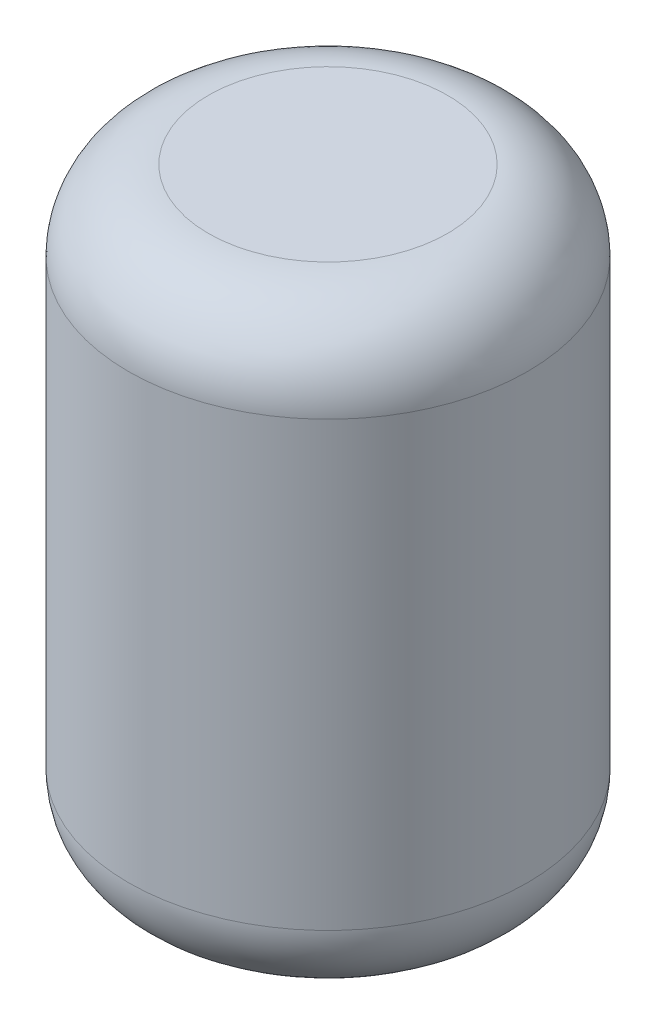
ISO-10303-21;
HEADER;
FILE_DESCRIPTION(('STEP AP214'),'2;1');
FILE_NAME('part.step','',(''),(''),'','','');
FILE_SCHEMA(('AUTOMOTIVE_DESIGN { 1 0 10303 214 1 1 1 1 }'));
ENDSEC;
DATA;
#1=APPLICATION_CONTEXT('core data for automotive mechanical design processes');
#2=APPLICATION_PROTOCOL_DEFINITION('international standard','automotive_design',2000,#1);
#3=PRODUCT_CONTEXT('',#1,'mechanical');
#4=PRODUCT('Part','Part','',(#3));
#5=PRODUCT_RELATED_PRODUCT_CATEGORY('part','',(#4));
#6=PRODUCT_DEFINITION_FORMATION('','',#4);
#7=PRODUCT_DEFINITION_CONTEXT('part definition',#1,'design');
#8=PRODUCT_DEFINITION('design','',#6,#7);
#9=PRODUCT_DEFINITION_SHAPE('','',#8);
#10=(LENGTH_UNIT() NAMED_UNIT(*) SI_UNIT(.MILLI.,.METRE.));
#11=(NAMED_UNIT(*) PLANE_ANGLE_UNIT() SI_UNIT($,.RADIAN.));
#12=(NAMED_UNIT(*) SI_UNIT($,.STERADIAN.) SOLID_ANGLE_UNIT());
#13=UNCERTAINTY_MEASURE_WITH_UNIT(LENGTH_MEASURE(1.E-05),#10,'distance_accuracy_value','');
#14=(GEOMETRIC_REPRESENTATION_CONTEXT(3) GLOBAL_UNCERTAINTY_ASSIGNED_CONTEXT((#13)) GLOBAL_UNIT_ASSIGNED_CONTEXT((#10,
#11,#12)) REPRESENTATION_CONTEXT('',''));
#15=CARTESIAN_POINT('',(0.,0.,0.));
#16=DIRECTION('',(0.,0.,1.));
#17=DIRECTION('',(1.,0.,0.));
#18=AXIS2_PLACEMENT_3D('',#15,#16,#17);
#19=CARTESIAN_POINT('',(0.,302.,0.));
#20=DIRECTION('',(0.,1.,0.));
#21=DIRECTION('',(0.,0.,1.));
#22=AXIS2_PLACEMENT_3D('',#19,#20,#21);
#23=PLANE('',#22);
#24=CARTESIAN_POINT('',(0.,302.,0.));
#25=DIRECTION('',(0.,1.,0.));
#26=DIRECTION('',(0.,0.,1.));
#27=AXIS2_PLACEMENT_3D('',#24,#25,#26);
#28=CIRCLE('',#27,60.);
#29=CARTESIAN_POINT('',(0.,302.,60.));
#30=VERTEX_POINT('',#29);
#31=EDGE_CURVE('E48',#30,#30,#28,.T.);
#32=ORIENTED_EDGE('',*,*,#31,.T.);
#33=EDGE_LOOP('',(#32));
#34=FACE_BOUND('',#33,.T.);
#35=ADVANCED_FACE('F32',(#34),#23,.T.);
#36=CARTESIAN_POINT('',(0.,0.,0.));
#37=DIRECTION('',(0.,1.,0.));
#38=DIRECTION('',(0.,0.,1.));
#39=AXIS2_PLACEMENT_3D('',#36,#37,#38);
#40=PLANE('',#39);
#41=CARTESIAN_POINT('',(0.,0.,0.));
#42=DIRECTION('',(0.,1.,0.));
#43=DIRECTION('',(0.,0.,1.));
#44=AXIS2_PLACEMENT_3D('',#41,#42,#43);
#45=CIRCLE('',#44,60.);
#46=CARTESIAN_POINT('',(0.,0.,60.));
#47=VERTEX_POINT('',#46);
#48=EDGE_CURVE('E10',#47,#47,#45,.F.);
#49=ORIENTED_EDGE('',*,*,#48,.T.);
#50=EDGE_LOOP('',(#49));
#51=FACE_BOUND('',#50,.T.);
#52=ADVANCED_FACE('F93',(#51),#40,.F.);
#53=CARTESIAN_POINT('',(0.,300.,0.));
#54=DIRECTION('',(0.,-1.,0.));
#55=DIRECTION('',(0.,0.,-1.));
#56=AXIS2_PLACEMENT_3D('',#53,#54,#55);
#57=CYLINDRICAL_SURFACE('',#56,100.);
#58=CARTESIAN_POINT('',(0.,262.,0.));
#59=DIRECTION('',(0.,1.,0.));
#60=DIRECTION('',(0.,0.,1.));
#61=AXIS2_PLACEMENT_3D('',#58,#59,#60);
#62=CIRCLE('',#61,100.);
#63=CARTESIAN_POINT('',(0.,262.,100.));
#64=VERTEX_POINT('',#63);
#65=EDGE_CURVE('E40',#64,#64,#62,.F.);
#66=ORIENTED_EDGE('',*,*,#65,.T.);
#67=EDGE_LOOP('',(#66));
#68=FACE_BOUND('',#67,.T.);
#69=CARTESIAN_POINT('',(0.,40.,0.));
#70=DIRECTION('',(0.,1.,0.));
#71=DIRECTION('',(0.,0.,1.));
#72=AXIS2_PLACEMENT_3D('',#69,#70,#71);
#73=CIRCLE('',#72,100.);
#74=CARTESIAN_POINT('',(0.,40.,100.));
#75=VERTEX_POINT('',#74);
#76=EDGE_CURVE('E44',#75,#75,#73,.T.);
#77=ORIENTED_EDGE('',*,*,#76,.T.);
#78=EDGE_LOOP('',(#77));
#79=FACE_BOUND('',#78,.T.);
#80=ADVANCED_FACE('F96',(#68,#79),#57,.T.);
#81=CARTESIAN_POINT('',(0.,262.,0.));
#82=DIRECTION('',(0.,1.,0.));
#83=DIRECTION('',(0.,0.,1.));
#84=AXIS2_PLACEMENT_3D('',#81,#82,#83);
#85=TOROIDAL_SURFACE('',#84,60.,40.);
#86=ORIENTED_EDGE('',*,*,#65,.F.);
#87=EDGE_LOOP('',(#86));
#88=FACE_BOUND('',#87,.T.);
#89=ORIENTED_EDGE('',*,*,#31,.F.);
#90=EDGE_LOOP('',(#89));
#91=FACE_BOUND('',#90,.T.);
#92=ADVANCED_FACE('F98',(#88,#91),#85,.T.);
#93=CARTESIAN_POINT('',(0.,40.,0.));
#94=DIRECTION('',(0.,1.,0.));
#95=DIRECTION('',(0.,0.,1.));
#96=AXIS2_PLACEMENT_3D('',#93,#94,#95);
#97=TOROIDAL_SURFACE('',#96,60.,40.);
#98=ORIENTED_EDGE('',*,*,#48,.F.);
#99=EDGE_LOOP('',(#98));
#100=FACE_BOUND('',#99,.T.);
#101=ORIENTED_EDGE('',*,*,#76,.F.);
#102=EDGE_LOOP('',(#101));
#103=FACE_BOUND('',#102,.T.);
#104=ADVANCED_FACE('F34',(#100,#103),#97,.T.);
#105=CLOSED_SHELL('',(#35,#52,#80,#92,#104));
#106=CARTESIAN_POINT('',(0.,300.,0.));
#107=DIRECTION('',(0.,-1.,0.));
#108=DIRECTION('',(0.,0.,-1.));
#109=AXIS2_PLACEMENT_3D('',#106,#107,#108);
#110=CYLINDRICAL_SURFACE('',#109,98.);
#111=CARTESIAN_POINT('',(0.,42.,0.));
#112=DIRECTION('',(0.,-1.,0.));
#113=DIRECTION('',(0.,0.,-1.));
#114=AXIS2_PLACEMENT_3D('',#111,#112,#113);
#115=CIRCLE('',#114,98.);
#116=CARTESIAN_POINT('',(0.,42.,-98.));
#117=VERTEX_POINT('',#116);
#118=EDGE_CURVE('E59',#117,#117,#115,.T.);
#119=ORIENTED_EDGE('',*,*,#118,.T.);
#120=EDGE_LOOP('',(#119));
#121=FACE_BOUND('',#120,.T.);
#122=CARTESIAN_POINT('',(0.,260.,0.));
#123=DIRECTION('',(0.,1.,0.));
#124=DIRECTION('',(0.,0.,1.));
#125=AXIS2_PLACEMENT_3D('',#122,#123,#124);
#126=CIRCLE('',#125,98.);
#127=CARTESIAN_POINT('',(0.,260.,98.));
#128=VERTEX_POINT('',#127);
#129=EDGE_CURVE('E62',#128,#128,#126,.T.);
#130=ORIENTED_EDGE('',*,*,#129,.T.);
#131=EDGE_LOOP('',(#130));
#132=FACE_BOUND('',#131,.T.);
#133=ADVANCED_FACE('F66',(#121,#132),#110,.F.);
#134=CARTESIAN_POINT('',(0.,2.,0.));
#135=DIRECTION('',(0.,-1.,0.));
#136=DIRECTION('',(0.,0.,-1.));
#137=AXIS2_PLACEMENT_3D('',#134,#135,#136);
#138=PLANE('',#137);
#139=CARTESIAN_POINT('',(0.,2.,0.));
#140=DIRECTION('',(0.,-1.,0.));
#141=DIRECTION('',(0.,0.,-1.));
#142=AXIS2_PLACEMENT_3D('',#139,#140,#141);
#143=CIRCLE('',#142,58.);
#144=CARTESIAN_POINT('',(0.,2.,-58.));
#145=VERTEX_POINT('',#144);
#146=EDGE_CURVE('E56',#145,#145,#143,.F.);
#147=ORIENTED_EDGE('',*,*,#146,.T.);
#148=EDGE_LOOP('',(#147));
#149=FACE_BOUND('',#148,.T.);
#150=ADVANCED_FACE('F82',(#149),#138,.F.);
#151=CARTESIAN_POINT('',(0.,300.,0.));
#152=DIRECTION('',(0.,1.,0.));
#153=DIRECTION('',(0.,0.,1.));
#154=AXIS2_PLACEMENT_3D('',#151,#152,#153);
#155=PLANE('',#154);
#156=CARTESIAN_POINT('',(0.,300.,0.));
#157=DIRECTION('',(0.,1.,0.));
#158=DIRECTION('',(0.,0.,1.));
#159=AXIS2_PLACEMENT_3D('',#156,#157,#158);
#160=CIRCLE('',#159,58.);
#161=CARTESIAN_POINT('',(0.,300.,58.));
#162=VERTEX_POINT('',#161);
#163=EDGE_CURVE('E53',#162,#162,#160,.F.);
#164=ORIENTED_EDGE('',*,*,#163,.T.);
#165=EDGE_LOOP('',(#164));
#166=FACE_BOUND('',#165,.T.);
#167=ADVANCED_FACE('F77',(#166),#155,.F.);
#168=CARTESIAN_POINT('',(0.,42.,0.));
#169=DIRECTION('',(0.,-1.,0.));
#170=DIRECTION('',(0.,0.,-1.));
#171=AXIS2_PLACEMENT_3D('',#168,#169,#170);
#172=TOROIDAL_SURFACE('',#171,58.,40.);
#173=ORIENTED_EDGE('',*,*,#146,.F.);
#174=EDGE_LOOP('',(#173));
#175=FACE_BOUND('',#174,.T.);
#176=ORIENTED_EDGE('',*,*,#118,.F.);
#177=EDGE_LOOP('',(#176));
#178=FACE_BOUND('',#177,.T.);
#179=ADVANCED_FACE('F70',(#175,#178),#172,.F.);
#180=CARTESIAN_POINT('',(0.,260.,0.));
#181=DIRECTION('',(0.,1.,0.));
#182=DIRECTION('',(0.,0.,1.));
#183=AXIS2_PLACEMENT_3D('',#180,#181,#182);
#184=TOROIDAL_SURFACE('',#183,58.,40.);
#185=ORIENTED_EDGE('',*,*,#163,.F.);
#186=EDGE_LOOP('',(#185));
#187=FACE_BOUND('',#186,.T.);
#188=ORIENTED_EDGE('',*,*,#129,.F.);
#189=EDGE_LOOP('',(#188));
#190=FACE_BOUND('',#189,.T.);
#191=ADVANCED_FACE('F68',(#187,#190),#184,.F.);
#192=CLOSED_SHELL('',(#133,#150,#167,#179,#191));
#193=ORIENTED_CLOSED_SHELL('',*,#192,.T.);
#194=BREP_WITH_VOIDS('B2',#105,(#193));
#195=ADVANCED_BREP_SHAPE_REPRESENTATION('',(#18,#194),#14);
#196=SHAPE_DEFINITION_REPRESENTATION(#9,#195);
ENDSEC;
END-ISO-10303-21;
